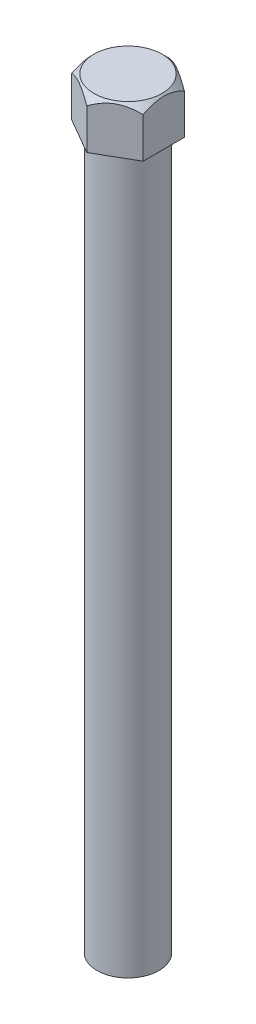
ISO-10303-21;
HEADER;
FILE_DESCRIPTION(('STEP AP214'),'2;1');
FILE_NAME('part.step','',(''),(''),'','','');
FILE_SCHEMA(('AUTOMOTIVE_DESIGN { 1 0 10303 214 1 1 1 1 }'));
ENDSEC;
DATA;
#1=APPLICATION_CONTEXT('core data for automotive mechanical design processes');
#2=APPLICATION_PROTOCOL_DEFINITION('international standard','automotive_design',2000,#1);
#3=PRODUCT_CONTEXT('',#1,'mechanical');
#4=PRODUCT('Part','Part','',(#3));
#5=PRODUCT_RELATED_PRODUCT_CATEGORY('part','',(#4));
#6=PRODUCT_DEFINITION_FORMATION('','',#4);
#7=PRODUCT_DEFINITION_CONTEXT('part definition',#1,'design');
#8=PRODUCT_DEFINITION('design','',#6,#7);
#9=PRODUCT_DEFINITION_SHAPE('','',#8);
#10=(LENGTH_UNIT() NAMED_UNIT(*) SI_UNIT(.MILLI.,.METRE.));
#11=(NAMED_UNIT(*) PLANE_ANGLE_UNIT() SI_UNIT($,.RADIAN.));
#12=(NAMED_UNIT(*) SI_UNIT($,.STERADIAN.) SOLID_ANGLE_UNIT());
#13=UNCERTAINTY_MEASURE_WITH_UNIT(LENGTH_MEASURE(1.E-05),#10,'distance_accuracy_value','');
#14=(GEOMETRIC_REPRESENTATION_CONTEXT(3) GLOBAL_UNCERTAINTY_ASSIGNED_CONTEXT((#13)) GLOBAL_UNIT_ASSIGNED_CONTEXT((#10,
#11,#12)) REPRESENTATION_CONTEXT('',''));
#15=CARTESIAN_POINT('',(0.,0.,0.));
#16=DIRECTION('',(0.,0.,1.));
#17=DIRECTION('',(1.,0.,0.));
#18=AXIS2_PLACEMENT_3D('',#15,#16,#17);
#19=CARTESIAN_POINT('',(3.81,35.56,2.19970452561247));
#20=DIRECTION('',(1.,0.,0.));
#21=DIRECTION('',(0.,0.,-1.));
#22=AXIS2_PLACEMENT_3D('',#19,#20,#21);
#23=PLANE('',#22);
#24=DIRECTION('',(0.,1.,0.));
#25=VECTOR('',#24,1.);
#26=CARTESIAN_POINT('',(3.81,35.56,-2.19970452561248));
#27=LINE('',#26,#25);
#28=CARTESIAN_POINT('',(3.81,35.56,-2.19970452561248));
#29=VERTEX_POINT('',#28);
#30=CARTESIAN_POINT('',(3.81,39.878,-2.19970452561248));
#31=VERTEX_POINT('',#30);
#32=EDGE_CURVE('E113',#29,#31,#27,.T.);
#33=ORIENTED_EDGE('',*,*,#32,.T.);
#34=CARTESIAN_POINT('',(3.81,36.6004378689662,-6.6648170667492));
#35=CARTESIAN_POINT('',(3.81,36.6859391731896,-6.56632848536769));
#36=CARTESIAN_POINT('',(3.81,36.771177093133,-6.46761122441616));
#37=CARTESIAN_POINT('',(3.81,36.9410522521094,-6.2696585386051));
#38=CARTESIAN_POINT('',(3.81,37.0256894812944,-6.17042310529652));
#39=CARTESIAN_POINT('',(3.81,37.2786626004871,-5.87176165356923));
#40=CARTESIAN_POINT('',(3.81,37.4459811514351,-5.67147094997249));
#41=CARTESIAN_POINT('',(3.81,37.7808381764522,-5.2633888641525));
#42=CARTESIAN_POINT('',(3.81,37.9482952649816,-5.0555304589889));
#43=CARTESIAN_POINT('',(3.81,38.278159861147,-4.63591596038523));
#44=CARTESIAN_POINT('',(3.81,38.4405686215215,-4.42416085501056));
#45=CARTESIAN_POINT('',(3.81,38.758656850965,-3.99516716202925));
#46=CARTESIAN_POINT('',(3.81,38.9143272310543,-3.77792175796816));
#47=CARTESIAN_POINT('',(3.81,39.1403067260629,-3.44676371790284));
#48=CARTESIAN_POINT('',(3.81,39.2144118387217,-3.33544264013406));
#49=CARTESIAN_POINT('',(3.81,39.3595079993943,-3.11079115652346));
#50=CARTESIAN_POINT('',(3.81,39.4304992576446,-2.99746088706294));
#51=CARTESIAN_POINT('',(3.81,39.5681472269113,-2.76934208249682));
#52=CARTESIAN_POINT('',(3.81,39.6348323768492,-2.65457078500959));
#53=CARTESIAN_POINT('',(3.81,39.763555762805,-2.42241746246672));
#54=CARTESIAN_POINT('',(3.81,39.8255934386438,-2.3050351248962));
#55=CARTESIAN_POINT('',(3.81,39.9437883973207,-2.06754882746468));
#56=CARTESIAN_POINT('',(3.81,39.9999545746011,-1.94744932957303));
#57=CARTESIAN_POINT('',(3.81,40.1050952750058,-1.70415080328242));
#58=CARTESIAN_POINT('',(3.81,40.1540717491944,-1.5809526264389));
#59=CARTESIAN_POINT('',(3.81,40.2441948575976,-1.32850417769835));
#60=CARTESIAN_POINT('',(3.81,40.2851372376437,-1.19917994964804));
#61=CARTESIAN_POINT('',(3.81,40.3557899801778,-0.937469048862037));
#62=CARTESIAN_POINT('',(3.81,40.3855021337527,-0.80508286804833));
#63=CARTESIAN_POINT('',(3.81,40.4317116912915,-0.538837115078899));
#64=CARTESIAN_POINT('',(3.81,40.4482911099778,-0.404992065282866));
#65=CARTESIAN_POINT('',(3.81,40.4673261161577,-0.136293471631241));
#66=CARTESIAN_POINT('',(3.81,40.469783268235,-0.00144004115015987));
#67=CARTESIAN_POINT('',(3.81,40.4603751479257,0.267964703444782));
#68=CARTESIAN_POINT('',(3.81,40.4484876262075,0.402515223096987));
#69=CARTESIAN_POINT('',(3.81,40.4112602016699,0.669728471485239));
#70=CARTESIAN_POINT('',(3.81,40.3859176146116,0.802390818112968));
#71=CARTESIAN_POINT('',(3.81,40.323229482327,1.06580474983321));
#72=CARTESIAN_POINT('',(3.81,40.2857990415766,1.19653576979048));
#73=CARTESIAN_POINT('',(3.81,40.2009762960965,1.4546741541493));
#74=CARTESIAN_POINT('',(3.81,40.153583840557,1.58208146820213));
#75=CARTESIAN_POINT('',(3.81,40.03946723945,1.86108370678092));
#76=CARTESIAN_POINT('',(3.81,39.9707822388157,2.01186968867425));
#77=CARTESIAN_POINT('',(3.81,39.8242442863632,2.3089576035806));
#78=CARTESIAN_POINT('',(3.81,39.7463860610469,2.4552568957867));
#79=CARTESIAN_POINT('',(3.81,39.5835363297663,2.74419508783386));
#80=CARTESIAN_POINT('',(3.81,39.4985304412338,2.88682581490941));
#81=CARTESIAN_POINT('',(3.81,39.323163040749,3.16869355855846));
#82=CARTESIAN_POINT('',(3.81,39.232802588185,3.3079312387964));
#83=CARTESIAN_POINT('',(3.81,39.0474047227056,3.58432725625075));
#84=CARTESIAN_POINT('',(3.81,38.9523448383975,3.72147044900067));
#85=CARTESIAN_POINT('',(3.81,38.7588882328022,3.99338122358109));
#86=CARTESIAN_POINT('',(3.81,38.6604913915128,4.12814871971245));
#87=CARTESIAN_POINT('',(3.81,38.4611481696537,4.39553426239863));
#88=CARTESIAN_POINT('',(3.81,38.360204905981,4.52815463882521));
#89=CARTESIAN_POINT('',(3.81,38.1561538897316,4.79172210278843));
#90=CARTESIAN_POINT('',(3.81,38.0530460663747,4.92266913538152));
#91=CARTESIAN_POINT('',(3.81,37.729273945489,5.3281891664482));
#92=CARTESIAN_POINT('',(3.81,37.5055561445589,5.60032540091741));
#93=CARTESIAN_POINT('',(3.81,37.1672179949605,6.00365805140612));
#94=CARTESIAN_POINT('',(3.81,37.0546134568209,6.13656290440892));
#95=CARTESIAN_POINT('',(3.81,36.8283079511779,6.4013855965485));
#96=CARTESIAN_POINT('',(3.81,36.7146072307592,6.53330364673626));
#97=CARTESIAN_POINT('',(3.81,36.6004378689662,6.6648170667492));
#98=B_SPLINE_CURVE_WITH_KNOTS('',3,(#34,#35,#36,#37,#38,#39,#40,#41,#42,#43,#44,#45,#46,#47,#48,
#49,#50,#51,#52,#53,#54,#55,#56,#57,#58,#59,#60,#61,#62,#63,#64,#65,#66,#67,#68,#69,#70,#71,#72,
#73,#74,#75,#76,#77,#78,#79,#80,#81,#82,#83,#84,#85,#86,#87,#88,#89,#90,#91,#92,#93,#94,#95,#96,
#97),.UNSPECIFIED.,.F.,.F.,(4,2,2,2,2,2,2,2,2,2,2,2,2,2,2,2,2,2,2,2,2,2,2,2,2,2,2,2,2,2,2,4),
(0.,0.391271874886431,0.782550149706495,1.5654665353666,2.36617212000806,3.16667739775445,
3.96823076663963,4.3693836017362,4.77050931057634,5.16863600891299,5.56681061812659,
5.96437303462223,6.36182736467757,6.76835446944253,7.17481671060235,7.57872010488784,
7.98257875048884,8.38706460773567,8.79163118884674,9.19910327946612,9.60658153904287,
10.1032388259304,10.6001830369558,11.0981522959736,11.5960233597326,12.0965628653487,
12.5971203902615,13.0970923996021,13.597080783349,14.6538243930868,15.1764029991833,
15.6988664463306),.UNSPECIFIED.);
#99=CARTESIAN_POINT('',(3.81,39.878,2.19970452561247));
#100=VERTEX_POINT('',#99);
#101=EDGE_CURVE('E54',#31,#100,#98,.T.);
#102=ORIENTED_EDGE('',*,*,#101,.T.);
#103=DIRECTION('',(0.,1.,0.));
#104=VECTOR('',#103,1.);
#105=CARTESIAN_POINT('',(3.81,35.56,2.19970452561247));
#106=LINE('',#105,#104);
#107=CARTESIAN_POINT('',(3.81,35.56,2.19970452561247));
#108=VERTEX_POINT('',#107);
#109=EDGE_CURVE('E61',#108,#100,#106,.T.);
#110=ORIENTED_EDGE('',*,*,#109,.F.);
#111=DIRECTION('',(0.,0.,-1.));
#112=VECTOR('',#111,1.);
#113=CARTESIAN_POINT('',(3.81,35.56,2.19970452561247));
#114=LINE('',#113,#112);
#115=EDGE_CURVE('E153',#108,#29,#114,.T.);
#116=ORIENTED_EDGE('',*,*,#115,.T.);
#117=EDGE_LOOP('',(#33,#102,#110,#116));
#118=FACE_BOUND('',#117,.T.);
#119=ADVANCED_FACE('F39',(#118),#23,.T.);
#120=CARTESIAN_POINT('',(0.,35.56,4.39940905122495));
#121=DIRECTION('',(0.5,0.,0.866025403784438));
#122=DIRECTION('',(0.866025403784438,0.,-0.5));
#123=AXIS2_PLACEMENT_3D('',#120,#121,#122);
#124=PLANE('',#123);
#125=ORIENTED_EDGE('',*,*,#109,.T.);
#126=CARTESIAN_POINT('',(3.8102,39.8778845254002,2.19958905555864));
#127=CARTESIAN_POINT('',(3.74468582562161,39.9157053861568,2.23741368177173));
#128=CARTESIAN_POINT('',(3.67867031315526,39.9523659269699,2.27552775566487));
#129=CARTESIAN_POINT('',(3.54553333924476,40.0230126780927,2.35239442339119));
#130=CARTESIAN_POINT('',(3.47841129759809,40.0569974276966,2.39114735220446));
#131=CARTESIAN_POINT('',(3.27460677891198,40.1546972941074,2.50881394592994));
#132=CARTESIAN_POINT('',(3.13619215991213,40.2137411766247,2.58872766346928));
#133=CARTESIAN_POINT('',(2.85712210600115,40.3148569072435,2.74984883421755));
#134=CARTESIAN_POINT('',(2.71653716352561,40.3571833902107,2.83101558859981));
#135=CARTESIAN_POINT('',(2.43226291962839,40.4224018038075,2.99514139983755));
#136=CARTESIAN_POINT('',(2.28858232460867,40.4453423935641,3.07809543004951));
#137=CARTESIAN_POINT('',(2.04095496164344,40.4660401965918,3.22106315471621));
#138=CARTESIAN_POINT('',(1.93732724227696,40.4691034661816,3.28089264638795));
#139=CARTESIAN_POINT('',(1.73023999287051,40.463939943459,3.4004545255785));
#140=CARTESIAN_POINT('',(1.6267805345171,40.455709193345,3.46018687170906));
#141=CARTESIAN_POINT('',(1.42084191212167,40.4284271060889,3.5790855907856));
#142=CARTESIAN_POINT('',(1.31836397507602,40.4093636665669,3.63825125532491));
#143=CARTESIAN_POINT('',(1.11516810134564,40.3614568386483,3.75556644772136));
#144=CARTESIAN_POINT('',(1.01445003034167,40.3326142000937,3.81371605312776));
#145=CARTESIAN_POINT('',(0.835650284315301,40.2732731155021,3.91694613462712));
#146=CARTESIAN_POINT('',(0.757172765002733,40.2443348311922,3.96225515152757));
#147=CARTESIAN_POINT('',(0.601626556642548,40.1817945893675,4.05205979679575));
#148=CARTESIAN_POINT('',(0.524557910552837,40.1481924899161,4.09655540036172));
#149=CARTESIAN_POINT('',(0.372072258811812,40.0770779046658,4.18459303244196));
#150=CARTESIAN_POINT('',(0.29665091617588,40.0395777153531,4.22813756491546));
#151=CARTESIAN_POINT('',(0.14720496357073,39.9611593950601,4.31442022588134));
#152=CARTESIAN_POINT('',(0.0731795303439203,39.9202433611593,4.35715882968172));
#153=CARTESIAN_POINT('',(-0.000199999999999113,39.8778845254002,4.39952452127879));
#154=B_SPLINE_CURVE_WITH_KNOTS('',3,(#126,#127,#128,#129,#130,#131,#132,#133,#134,#135,#136,
#137,#138,#139,#140,#141,#142,#143,#144,#145,#146,#147,#148,#149,#150,#151,#152,#153),
.UNSPECIFIED.,.F.,.F.,(4,2,2,2,2,2,2,2,2,2,2,2,2,4),(0.,0.253711067376108,0.507559688133014,
1.01799787781204,1.52033002790435,2.021397533328,2.37998555140284,2.73869926278799,
3.09781452256134,3.45690225258973,3.74214799282694,4.0274024160243,4.31178284720288,
4.59598995563032),.UNSPECIFIED.);
#155=CARTESIAN_POINT('',(0.,39.878,4.39940905122495));
#156=VERTEX_POINT('',#155);
#157=EDGE_CURVE('E162',#100,#156,#154,.T.);
#158=ORIENTED_EDGE('',*,*,#157,.T.);
#159=DIRECTION('',(0.,1.,0.));
#160=VECTOR('',#159,1.);
#161=CARTESIAN_POINT('',(0.,35.56,4.39940905122495));
#162=LINE('',#161,#160);
#163=CARTESIAN_POINT('',(0.,35.56,4.39940905122495));
#164=VERTEX_POINT('',#163);
#165=EDGE_CURVE('E123',#164,#156,#162,.T.);
#166=ORIENTED_EDGE('',*,*,#165,.F.);
#167=DIRECTION('',(0.866025403784438,0.,-0.5));
#168=VECTOR('',#167,1.);
#169=CARTESIAN_POINT('',(0.,35.56,4.39940905122495));
#170=LINE('',#169,#168);
#171=EDGE_CURVE('E117',#164,#108,#170,.T.);
#172=ORIENTED_EDGE('',*,*,#171,.T.);
#173=EDGE_LOOP('',(#125,#158,#166,#172));
#174=FACE_BOUND('',#173,.T.);
#175=ADVANCED_FACE('F205',(#174),#124,.T.);
#176=CARTESIAN_POINT('',(-3.81,35.56,2.19970452561248));
#177=DIRECTION('',(-0.5,0.,0.866025403784439));
#178=DIRECTION('',(0.866025403784439,0.,0.5));
#179=AXIS2_PLACEMENT_3D('',#176,#177,#178);
#180=PLANE('',#179);
#181=ORIENTED_EDGE('',*,*,#165,.T.);
#182=CARTESIAN_POINT('',(0.000200000000001775,39.8778845254002,4.39952452127879));
#183=CARTESIAN_POINT('',(-0.0653141743783889,39.9157053861568,4.36169989506569));
#184=CARTESIAN_POINT('',(-0.13132968684474,39.9523659269699,4.32358582117255));
#185=CARTESIAN_POINT('',(-0.264466660755238,40.0230126780927,4.24671915344623));
#186=CARTESIAN_POINT('',(-0.331588702401912,40.0569974276966,4.20796622463297));
#187=CARTESIAN_POINT('',(-0.535393221088021,40.1546972941074,4.09029963090748));
#188=CARTESIAN_POINT('',(-0.673807840087866,40.2137411766247,4.01038591336814));
#189=CARTESIAN_POINT('',(-0.952877893998851,40.3148569072435,3.84926474261987));
#190=CARTESIAN_POINT('',(-1.09346283647439,40.3571833902107,3.76809798823761));
#191=CARTESIAN_POINT('',(-1.37773708037161,40.4224018038075,3.60397217699987));
#192=CARTESIAN_POINT('',(-1.52141767539133,40.4453423935641,3.52101814678791));
#193=CARTESIAN_POINT('',(-1.76904503835656,40.4660401965918,3.37805042212121));
#194=CARTESIAN_POINT('',(-1.87267275772304,40.4691034661816,3.31822093044947));
#195=CARTESIAN_POINT('',(-2.07976000712949,40.463939943459,3.19865905125892));
#196=CARTESIAN_POINT('',(-2.1832194654829,40.455709193345,3.13892670512837));
#197=CARTESIAN_POINT('',(-2.38915808787833,40.4284271060889,3.02002798605182));
#198=CARTESIAN_POINT('',(-2.49163602492398,40.409363666567,2.96086232151252));
#199=CARTESIAN_POINT('',(-2.69483189865436,40.3614568386483,2.84354712911606));
#200=CARTESIAN_POINT('',(-2.79554996965833,40.3326142000937,2.78539752370966));
#201=CARTESIAN_POINT('',(-2.9743497156847,40.2732731155021,2.6821674422103));
#202=CARTESIAN_POINT('',(-3.05282723499727,40.2443348311922,2.63685842530985));
#203=CARTESIAN_POINT('',(-3.20837344335746,40.1817945893676,2.54705378004167));
#204=CARTESIAN_POINT('',(-3.28544208944717,40.1481924899161,2.5025581764757));
#205=CARTESIAN_POINT('',(-3.43792774118819,40.0770779046658,2.41452054439546));
#206=CARTESIAN_POINT('',(-3.51334908382412,40.0395777153531,2.37097601192197));
#207=CARTESIAN_POINT('',(-3.66279503642927,39.96115939506,2.28469335095608));
#208=CARTESIAN_POINT('',(-3.73682046965608,39.9202433611593,2.24195474715571));
#209=CARTESIAN_POINT('',(-3.8102,39.8778845254002,2.19958905555864));
#210=B_SPLINE_CURVE_WITH_KNOTS('',3,(#182,#183,#184,#185,#186,#187,#188,#189,#190,#191,#192,
#193,#194,#195,#196,#197,#198,#199,#200,#201,#202,#203,#204,#205,#206,#207,#208,#209),
.UNSPECIFIED.,.F.,.F.,(4,2,2,2,2,2,2,2,2,2,2,2,2,4),(0.,0.253711067376108,0.507559688133014,
1.01799787781204,1.52033002790435,2.021397533328,2.37998555140284,2.73869926278799,
3.09781452256134,3.45690225258973,3.74214799282695,4.02740241602431,4.31178284720289,
4.59598995563033),.UNSPECIFIED.);
#211=CARTESIAN_POINT('',(-3.81,39.878,2.19970452561247));
#212=VERTEX_POINT('',#211);
#213=EDGE_CURVE('E145',#156,#212,#210,.T.);
#214=ORIENTED_EDGE('',*,*,#213,.T.);
#215=DIRECTION('',(0.,1.,0.));
#216=VECTOR('',#215,1.);
#217=CARTESIAN_POINT('',(-3.81,35.56,2.19970452561248));
#218=LINE('',#217,#216);
#219=CARTESIAN_POINT('',(-3.81,35.56,2.19970452561248));
#220=VERTEX_POINT('',#219);
#221=EDGE_CURVE('E115',#220,#212,#218,.T.);
#222=ORIENTED_EDGE('',*,*,#221,.F.);
#223=DIRECTION('',(0.866025403784439,0.,0.5));
#224=VECTOR('',#223,1.);
#225=CARTESIAN_POINT('',(-3.81,35.56,2.19970452561248));
#226=LINE('',#225,#224);
#227=EDGE_CURVE('E143',#220,#164,#226,.T.);
#228=ORIENTED_EDGE('',*,*,#227,.T.);
#229=EDGE_LOOP('',(#181,#214,#222,#228));
#230=FACE_BOUND('',#229,.T.);
#231=ADVANCED_FACE('F142',(#230),#180,.T.);
#232=CARTESIAN_POINT('',(-3.81,35.56,-2.19970452561247));
#233=DIRECTION('',(-1.,0.,0.));
#234=DIRECTION('',(0.,0.,1.));
#235=AXIS2_PLACEMENT_3D('',#232,#233,#234);
#236=PLANE('',#235);
#237=ORIENTED_EDGE('',*,*,#221,.T.);
#238=CARTESIAN_POINT('',(-3.81,36.6004378689662,6.6648170667492));
#239=CARTESIAN_POINT('',(-3.81,36.6859391731896,6.56632848536769));
#240=CARTESIAN_POINT('',(-3.81,36.771177093133,6.46761122441616));
#241=CARTESIAN_POINT('',(-3.81,36.9410522521094,6.26965853860511));
#242=CARTESIAN_POINT('',(-3.81,37.0256894812944,6.17042310529652));
#243=CARTESIAN_POINT('',(-3.81,37.2786626004871,5.87176165356923));
#244=CARTESIAN_POINT('',(-3.81,37.4459811514351,5.67147094997249));
#245=CARTESIAN_POINT('',(-3.81,37.7808381764522,5.2633888641525));
#246=CARTESIAN_POINT('',(-3.81,37.9482952649816,5.0555304589889));
#247=CARTESIAN_POINT('',(-3.81,38.278159861147,4.63591596038522));
#248=CARTESIAN_POINT('',(-3.81,38.4405686215215,4.42416085501056));
#249=CARTESIAN_POINT('',(-3.81,38.758656850965,3.99516716202925));
#250=CARTESIAN_POINT('',(-3.81,38.9143272310543,3.77792175796816));
#251=CARTESIAN_POINT('',(-3.81,39.1403067260629,3.44676371790284));
#252=CARTESIAN_POINT('',(-3.81,39.2144118387217,3.33544264013406));
#253=CARTESIAN_POINT('',(-3.81,39.3595079993943,3.11079115652346));
#254=CARTESIAN_POINT('',(-3.81,39.4304992576446,2.99746088706294));
#255=CARTESIAN_POINT('',(-3.81,39.5681472269113,2.76934208249682));
#256=CARTESIAN_POINT('',(-3.81,39.6348323768492,2.65457078500959));
#257=CARTESIAN_POINT('',(-3.81,39.763555762805,2.42241746246672));
#258=CARTESIAN_POINT('',(-3.81,39.8255934386438,2.3050351248962));
#259=CARTESIAN_POINT('',(-3.81,39.9437883973207,2.06754882746468));
#260=CARTESIAN_POINT('',(-3.81,39.9999545746011,1.94744932957303));
#261=CARTESIAN_POINT('',(-3.81,40.1050952750058,1.70415080328242));
#262=CARTESIAN_POINT('',(-3.81,40.1540717491944,1.5809526264389));
#263=CARTESIAN_POINT('',(-3.81,40.2441948575976,1.32850417769834));
#264=CARTESIAN_POINT('',(-3.81,40.2851372376437,1.19917994964804));
#265=CARTESIAN_POINT('',(-3.81,40.3557899801778,0.937469048862035));
#266=CARTESIAN_POINT('',(-3.81,40.3855021337527,0.805082868048328));
#267=CARTESIAN_POINT('',(-3.81,40.4317116912915,0.538837115078898));
#268=CARTESIAN_POINT('',(-3.81,40.4482911099778,0.404992065282865));
#269=CARTESIAN_POINT('',(-3.81,40.4673261161577,0.13629347163124));
#270=CARTESIAN_POINT('',(-3.81,40.469783268235,0.00144004115015906));
#271=CARTESIAN_POINT('',(-3.81,40.4603751479257,-0.267964703444782));
#272=CARTESIAN_POINT('',(-3.81,40.4484876262075,-0.402515223096985));
#273=CARTESIAN_POINT('',(-3.81,40.4112602016699,-0.669728471485237));
#274=CARTESIAN_POINT('',(-3.81,40.3859176146116,-0.802390818112966));
#275=CARTESIAN_POINT('',(-3.81,40.323229482327,-1.0658047498332));
#276=CARTESIAN_POINT('',(-3.81,40.2857990415766,-1.19653576979048));
#277=CARTESIAN_POINT('',(-3.81,40.2009762960965,-1.4546741541493));
#278=CARTESIAN_POINT('',(-3.81,40.153583840557,-1.58208146820213));
#279=CARTESIAN_POINT('',(-3.81,40.0394672394501,-1.86108370678092));
#280=CARTESIAN_POINT('',(-3.81,39.9707822388157,-2.01186968867425));
#281=CARTESIAN_POINT('',(-3.81,39.8242442863632,-2.3089576035806));
#282=CARTESIAN_POINT('',(-3.81,39.7463860610469,-2.45525689578669));
#283=CARTESIAN_POINT('',(-3.81,39.5835363297663,-2.74419508783386));
#284=CARTESIAN_POINT('',(-3.81,39.4985304412338,-2.8868258149094));
#285=CARTESIAN_POINT('',(-3.81,39.323163040749,-3.16869355855845));
#286=CARTESIAN_POINT('',(-3.81,39.232802588185,-3.30793123879639));
#287=CARTESIAN_POINT('',(-3.81,39.0474047227056,-3.58432725625074));
#288=CARTESIAN_POINT('',(-3.81,38.9523448383975,-3.72147044900067));
#289=CARTESIAN_POINT('',(-3.81,38.7588882328022,-3.99338122358108));
#290=CARTESIAN_POINT('',(-3.81,38.6604913915128,-4.12814871971244));
#291=CARTESIAN_POINT('',(-3.81,38.4611481696537,-4.39553426239862));
#292=CARTESIAN_POINT('',(-3.81,38.360204905981,-4.52815463882521));
#293=CARTESIAN_POINT('',(-3.81,38.1561538897316,-4.79172210278843));
#294=CARTESIAN_POINT('',(-3.81,38.0530460663748,-4.92266913538152));
#295=CARTESIAN_POINT('',(-3.81,37.729273945489,-5.3281891664482));
#296=CARTESIAN_POINT('',(-3.81,37.5055561445589,-5.6003254009174));
#297=CARTESIAN_POINT('',(-3.81,37.1672179949605,-6.00365805140611));
#298=CARTESIAN_POINT('',(-3.81,37.054613456821,-6.13656290440891));
#299=CARTESIAN_POINT('',(-3.81,36.8283079511779,-6.40138559654849));
#300=CARTESIAN_POINT('',(-3.81,36.7146072307592,-6.53330364673625));
#301=CARTESIAN_POINT('',(-3.81,36.6004378689662,-6.66481706674919));
#302=B_SPLINE_CURVE_WITH_KNOTS('',3,(#238,#239,#240,#241,#242,#243,#244,#245,#246,#247,#248,
#249,#250,#251,#252,#253,#254,#255,#256,#257,#258,#259,#260,#261,#262,#263,#264,#265,#266,#267,
#268,#269,#270,#271,#272,#273,#274,#275,#276,#277,#278,#279,#280,#281,#282,#283,#284,#285,#286,
#287,#288,#289,#290,#291,#292,#293,#294,#295,#296,#297,#298,#299,#300,#301),.UNSPECIFIED.,.F.,
.F.,(4,2,2,2,2,2,2,2,2,2,2,2,2,2,2,2,2,2,2,2,2,2,2,2,2,2,2,2,2,2,2,4),(0.,0.391271874886428,
0.782550149706494,1.5654665353666,2.36617212000807,3.16667739775445,3.96823076663963,
4.36938360173621,4.77050931057634,5.16863600891299,5.56681061812659,5.96437303462223,
6.36182736467758,6.76835446944254,7.17481671060236,7.57872010488784,7.98257875048884,
8.38706460773567,8.79163118884674,9.19910327946612,9.60658153904287,10.1032388259304,
10.6001830369558,11.0981522959736,11.5960233597326,12.0965628653486,12.5971203902615,
13.097092399602,13.597080783349,14.6538243930868,15.1764029991833,15.6988664463306),.UNSPECIFIED.);
#303=CARTESIAN_POINT('',(-3.81,39.878,-2.19970452561247));
#304=VERTEX_POINT('',#303);
#305=EDGE_CURVE('E107',#212,#304,#302,.T.);
#306=ORIENTED_EDGE('',*,*,#305,.T.);
#307=DIRECTION('',(0.,1.,0.));
#308=VECTOR('',#307,1.);
#309=CARTESIAN_POINT('',(-3.81,35.56,-2.19970452561247));
#310=LINE('',#309,#308);
#311=CARTESIAN_POINT('',(-3.81,35.56,-2.19970452561247));
#312=VERTEX_POINT('',#311);
#313=EDGE_CURVE('E106',#312,#304,#310,.T.);
#314=ORIENTED_EDGE('',*,*,#313,.F.);
#315=DIRECTION('',(0.,0.,1.));
#316=VECTOR('',#315,1.);
#317=CARTESIAN_POINT('',(-3.81,35.56,-2.19970452561247));
#318=LINE('',#317,#316);
#319=EDGE_CURVE('E137',#312,#220,#318,.T.);
#320=ORIENTED_EDGE('',*,*,#319,.T.);
#321=EDGE_LOOP('',(#237,#306,#314,#320));
#322=FACE_BOUND('',#321,.T.);
#323=ADVANCED_FACE('F135',(#322),#236,.T.);
#324=CARTESIAN_POINT('',(0.,35.56,-4.39940905122495));
#325=DIRECTION('',(-0.500000000000001,0.,-0.866025403784438));
#326=DIRECTION('',(-0.866025403784438,0.,0.500000000000001));
#327=AXIS2_PLACEMENT_3D('',#324,#325,#326);
#328=PLANE('',#327);
#329=ORIENTED_EDGE('',*,*,#313,.T.);
#330=CARTESIAN_POINT('',(-3.8102,39.8778845254002,-2.19958905555863));
#331=CARTESIAN_POINT('',(-3.74468582562161,39.9157053861568,-2.23741368177173));
#332=CARTESIAN_POINT('',(-3.67867031315526,39.9523659269699,-2.27552775566487));
#333=CARTESIAN_POINT('',(-3.54553333924476,40.0230126780927,-2.35239442339119));
#334=CARTESIAN_POINT('',(-3.47841129759809,40.0569974276966,-2.39114735220445));
#335=CARTESIAN_POINT('',(-3.27460677891198,40.1546972941074,-2.50881394592994));
#336=CARTESIAN_POINT('',(-3.13619215991213,40.2137411766247,-2.58872766346928));
#337=CARTESIAN_POINT('',(-2.85712210600115,40.3148569072435,-2.74984883421755));
#338=CARTESIAN_POINT('',(-2.71653716352561,40.3571833902107,-2.83101558859981));
#339=CARTESIAN_POINT('',(-2.43226291962839,40.4224018038075,-2.99514139983755));
#340=CARTESIAN_POINT('',(-2.28858232460867,40.4453423935641,-3.07809543004951));
#341=CARTESIAN_POINT('',(-2.04095496164344,40.4660401965918,-3.22106315471621));
#342=CARTESIAN_POINT('',(-1.93732724227696,40.4691034661816,-3.28089264638795));
#343=CARTESIAN_POINT('',(-1.73023999287051,40.463939943459,-3.4004545255785));
#344=CARTESIAN_POINT('',(-1.62678053451711,40.455709193345,-3.46018687170905));
#345=CARTESIAN_POINT('',(-1.42084191212167,40.4284271060889,-3.5790855907856));
#346=CARTESIAN_POINT('',(-1.31836397507602,40.409363666567,-3.6382512553249));
#347=CARTESIAN_POINT('',(-1.11516810134564,40.3614568386483,-3.75556644772136));
#348=CARTESIAN_POINT('',(-1.01445003034167,40.3326142000937,-3.81371605312776));
#349=CARTESIAN_POINT('',(-0.835650284315301,40.2732731155021,-3.91694613462712));
#350=CARTESIAN_POINT('',(-0.757172765002733,40.2443348311922,-3.96225515152757));
#351=CARTESIAN_POINT('',(-0.601626556642548,40.1817945893676,-4.05205979679575));
#352=CARTESIAN_POINT('',(-0.524557910552837,40.1481924899161,-4.09655540036172));
#353=CARTESIAN_POINT('',(-0.372072258811811,40.0770779046658,-4.18459303244196));
#354=CARTESIAN_POINT('',(-0.29665091617588,40.0395777153531,-4.22813756491546));
#355=CARTESIAN_POINT('',(-0.14720496357073,39.96115939506,-4.31442022588134));
#356=CARTESIAN_POINT('',(-0.0731795303439212,39.9202433611593,-4.35715882968172));
#357=CARTESIAN_POINT('',(0.000200000000000036,39.8778845254002,-4.39952452127879));
#358=B_SPLINE_CURVE_WITH_KNOTS('',3,(#330,#331,#332,#333,#334,#335,#336,#337,#338,#339,#340,
#341,#342,#343,#344,#345,#346,#347,#348,#349,#350,#351,#352,#353,#354,#355,#356,#357),
.UNSPECIFIED.,.F.,.F.,(4,2,2,2,2,2,2,2,2,2,2,2,2,4),(0.,0.253711067376107,0.507559688133014,
1.01799787781204,1.52033002790435,2.021397533328,2.37998555140284,2.73869926278799,
3.09781452256134,3.45690225258973,3.74214799282695,4.02740241602431,4.31178284720289,
4.59598995563033),.UNSPECIFIED.);
#359=CARTESIAN_POINT('',(0.,39.878,-4.39940905122495));
#360=VERTEX_POINT('',#359);
#361=EDGE_CURVE('E93',#304,#360,#358,.T.);
#362=ORIENTED_EDGE('',*,*,#361,.T.);
#363=DIRECTION('',(0.,1.,0.));
#364=VECTOR('',#363,1.);
#365=CARTESIAN_POINT('',(0.,35.56,-4.39940905122495));
#366=LINE('',#365,#364);
#367=CARTESIAN_POINT('',(0.,35.56,-4.39940905122495));
#368=VERTEX_POINT('',#367);
#369=EDGE_CURVE('E104',#368,#360,#366,.T.);
#370=ORIENTED_EDGE('',*,*,#369,.F.);
#371=DIRECTION('',(-0.866025403784438,0.,0.500000000000001));
#372=VECTOR('',#371,1.);
#373=CARTESIAN_POINT('',(0.,35.56,-4.39940905122495));
#374=LINE('',#373,#372);
#375=EDGE_CURVE('E148',#368,#312,#374,.T.);
#376=ORIENTED_EDGE('',*,*,#375,.T.);
#377=EDGE_LOOP('',(#329,#362,#370,#376));
#378=FACE_BOUND('',#377,.T.);
#379=ADVANCED_FACE('F102',(#378),#328,.T.);
#380=CARTESIAN_POINT('',(3.81,35.56,-2.19970452561248));
#381=DIRECTION('',(0.5,0.,-0.866025403784439));
#382=DIRECTION('',(-0.866025403784439,0.,-0.5));
#383=AXIS2_PLACEMENT_3D('',#380,#381,#382);
#384=PLANE('',#383);
#385=ORIENTED_EDGE('',*,*,#369,.T.);
#386=CARTESIAN_POINT('',(-0.0002,39.8778845254002,-4.39952452127879));
#387=CARTESIAN_POINT('',(0.0653141743783912,39.9157053861568,-4.36169989506569));
#388=CARTESIAN_POINT('',(0.131329686844742,39.9523659269699,-4.32358582117255));
#389=CARTESIAN_POINT('',(0.264466660755241,40.0230126780927,-4.24671915344623));
#390=CARTESIAN_POINT('',(0.331588702401915,40.0569974276966,-4.20796622463296));
#391=CARTESIAN_POINT('',(0.535393221088024,40.1546972941074,-4.09029963090748));
#392=CARTESIAN_POINT('',(0.67380784008787,40.2137411766247,-4.01038591336814));
#393=CARTESIAN_POINT('',(0.952877893998856,40.3148569072435,-3.84926474261987));
#394=CARTESIAN_POINT('',(1.09346283647439,40.3571833902107,-3.76809798823761));
#395=CARTESIAN_POINT('',(1.37773708037162,40.4224018038075,-3.60397217699987));
#396=CARTESIAN_POINT('',(1.52141767539133,40.4453423935641,-3.52101814678791));
#397=CARTESIAN_POINT('',(1.76904503835657,40.4660401965918,-3.37805042212121));
#398=CARTESIAN_POINT('',(1.87267275772304,40.4691034661816,-3.31822093044947));
#399=CARTESIAN_POINT('',(2.07976000712949,40.463939943459,-3.19865905125892));
#400=CARTESIAN_POINT('',(2.1832194654829,40.455709193345,-3.13892670512837));
#401=CARTESIAN_POINT('',(2.38915808787834,40.4284271060889,-3.02002798605182));
#402=CARTESIAN_POINT('',(2.49163602492399,40.409363666567,-2.96086232151252));
#403=CARTESIAN_POINT('',(2.69483189865437,40.3614568386483,-2.84354712911606));
#404=CARTESIAN_POINT('',(2.79554996965834,40.3326142000937,-2.78539752370966));
#405=CARTESIAN_POINT('',(2.97434971568471,40.2732731155021,-2.6821674422103));
#406=CARTESIAN_POINT('',(3.05282723499728,40.2443348311922,-2.63685842530985));
#407=CARTESIAN_POINT('',(3.20837344335746,40.1817945893675,-2.54705378004167));
#408=CARTESIAN_POINT('',(3.28544208944717,40.1481924899161,-2.5025581764757));
#409=CARTESIAN_POINT('',(3.4379277411882,40.0770779046658,-2.41452054439546));
#410=CARTESIAN_POINT('',(3.51334908382413,40.0395777153531,-2.37097601192196));
#411=CARTESIAN_POINT('',(3.66279503642927,39.96115939506,-2.28469335095608));
#412=CARTESIAN_POINT('',(3.73682046965608,39.9202433611593,-2.24195474715571));
#413=CARTESIAN_POINT('',(3.8102,39.8778845254002,-2.19958905555864));
#414=B_SPLINE_CURVE_WITH_KNOTS('',3,(#386,#387,#388,#389,#390,#391,#392,#393,#394,#395,#396,
#397,#398,#399,#400,#401,#402,#403,#404,#405,#406,#407,#408,#409,#410,#411,#412,#413),
.UNSPECIFIED.,.F.,.F.,(4,2,2,2,2,2,2,2,2,2,2,2,2,4),(0.,0.253711067376109,0.507559688133016,
1.01799787781204,1.52033002790436,2.021397533328,2.37998555140285,2.73869926278799,
3.09781452256134,3.45690225258974,3.74214799282695,4.02740241602432,4.31178284720289,
4.59598995563032),.UNSPECIFIED.);
#415=EDGE_CURVE('E90',#360,#31,#414,.T.);
#416=ORIENTED_EDGE('',*,*,#415,.T.);
#417=ORIENTED_EDGE('',*,*,#32,.F.);
#418=DIRECTION('',(-0.866025403784438,0.,-0.5));
#419=VECTOR('',#418,1.);
#420=CARTESIAN_POINT('',(3.81,35.56,-2.19970452561248));
#421=LINE('',#420,#419);
#422=EDGE_CURVE('E112',#29,#368,#421,.T.);
#423=ORIENTED_EDGE('',*,*,#422,.T.);
#424=EDGE_LOOP('',(#385,#416,#417,#423));
#425=FACE_BOUND('',#424,.T.);
#426=ADVANCED_FACE('F110',(#425),#384,.T.);
#427=CARTESIAN_POINT('',(0.,40.64,0.));
#428=DIRECTION('',(0.,-1.,0.));
#429=DIRECTION('',(0.,0.,-1.));
#430=AXIS2_PLACEMENT_3D('',#427,#428,#429);
#431=CYLINDRICAL_SURFACE('',#430,3.302);
#432=CARTESIAN_POINT('',(0.,-40.64,0.));
#433=DIRECTION('',(0.,1.,0.));
#434=DIRECTION('',(0.,0.,1.));
#435=AXIS2_PLACEMENT_3D('',#432,#433,#434);
#436=CIRCLE('',#435,3.302);
#437=CARTESIAN_POINT('',(0.,-40.64,3.302));
#438=VERTEX_POINT('',#437);
#439=EDGE_CURVE('E47',#438,#438,#436,.T.);
#440=ORIENTED_EDGE('',*,*,#439,.T.);
#441=EDGE_LOOP('',(#440));
#442=FACE_BOUND('',#441,.T.);
#443=CARTESIAN_POINT('',(0.,35.56,0.));
#444=DIRECTION('',(0.,1.,0.));
#445=DIRECTION('',(0.,0.,1.));
#446=AXIS2_PLACEMENT_3D('',#443,#444,#445);
#447=CIRCLE('',#446,3.302);
#448=CARTESIAN_POINT('',(0.,35.56,3.302));
#449=VERTEX_POINT('',#448);
#450=EDGE_CURVE('E11',#449,#449,#447,.T.);
#451=ORIENTED_EDGE('',*,*,#450,.F.);
#452=EDGE_LOOP('',(#451));
#453=FACE_BOUND('',#452,.T.);
#454=ADVANCED_FACE('F41',(#442,#453),#431,.T.);
#455=CARTESIAN_POINT('',(0.,-40.64,0.));
#456=DIRECTION('',(0.,1.,0.));
#457=DIRECTION('',(0.,0.,1.));
#458=AXIS2_PLACEMENT_3D('',#455,#456,#457);
#459=PLANE('',#458);
#460=ORIENTED_EDGE('',*,*,#439,.F.);
#461=EDGE_LOOP('',(#460));
#462=FACE_BOUND('',#461,.T.);
#463=ADVANCED_FACE('F216',(#462),#459,.F.);
#464=CARTESIAN_POINT('',(0.,35.56,0.));
#465=DIRECTION('',(0.,1.,0.));
#466=DIRECTION('',(0.,0.,1.));
#467=AXIS2_PLACEMENT_3D('',#464,#465,#466);
#468=PLANE('',#467);
#469=ORIENTED_EDGE('',*,*,#450,.T.);
#470=EDGE_LOOP('',(#469));
#471=FACE_BOUND('',#470,.T.);
#472=ORIENTED_EDGE('',*,*,#115,.F.);
#473=ORIENTED_EDGE('',*,*,#171,.F.);
#474=ORIENTED_EDGE('',*,*,#227,.F.);
#475=ORIENTED_EDGE('',*,*,#319,.F.);
#476=ORIENTED_EDGE('',*,*,#375,.F.);
#477=ORIENTED_EDGE('',*,*,#422,.F.);
#478=EDGE_LOOP('',(#472,#473,#474,#475,#476,#477));
#479=FACE_BOUND('',#478,.T.);
#480=ADVANCED_FACE('F147',(#471,#479),#468,.F.);
#481=CARTESIAN_POINT('',(0.,39.878,0.));
#482=DIRECTION('',(0.,-1.,0.));
#483=DIRECTION('',(0.,0.,-1.));
#484=AXIS2_PLACEMENT_3D('',#481,#482,#483);
#485=CONICAL_SURFACE('',#484,4.39940905122495,0.78539816339745);
#486=CARTESIAN_POINT('',(0.,40.64,0.));
#487=DIRECTION('',(0.,-1.,0.));
#488=DIRECTION('',(0.,0.,-1.));
#489=AXIS2_PLACEMENT_3D('',#486,#487,#488);
#490=CIRCLE('',#489,3.63740905122495);
#491=CARTESIAN_POINT('',(0.,40.64,-3.63740905122495));
#492=VERTEX_POINT('',#491);
#493=EDGE_CURVE('E98',#492,#492,#490,.T.);
#494=ORIENTED_EDGE('',*,*,#493,.T.);
#495=EDGE_LOOP('',(#494));
#496=FACE_BOUND('',#495,.T.);
#497=ORIENTED_EDGE('',*,*,#415,.F.);
#498=ORIENTED_EDGE('',*,*,#361,.F.);
#499=ORIENTED_EDGE('',*,*,#305,.F.);
#500=ORIENTED_EDGE('',*,*,#213,.F.);
#501=ORIENTED_EDGE('',*,*,#157,.F.);
#502=ORIENTED_EDGE('',*,*,#101,.F.);
#503=EDGE_LOOP('',(#497,#498,#499,#500,#501,#502));
#504=FACE_BOUND('',#503,.T.);
#505=ADVANCED_FACE('F92',(#496,#504),#485,.T.);
#506=CARTESIAN_POINT('',(0.,40.64,0.));
#507=DIRECTION('',(0.,1.,0.));
#508=DIRECTION('',(0.,0.,1.));
#509=AXIS2_PLACEMENT_3D('',#506,#507,#508);
#510=PLANE('',#509);
#511=ORIENTED_EDGE('',*,*,#493,.F.);
#512=EDGE_LOOP('',(#511));
#513=FACE_BOUND('',#512,.T.);
#514=ADVANCED_FACE('F175',(#513),#510,.T.);
#515=CLOSED_SHELL('',(#119,#175,#231,#323,#379,#426,#454,#463,#480,#505,#514));
#516=MANIFOLD_SOLID_BREP('B2',#515);
#517=ADVANCED_BREP_SHAPE_REPRESENTATION('',(#18,#516),#14);
#518=SHAPE_DEFINITION_REPRESENTATION(#9,#517);
ENDSEC;
END-ISO-10303-21;
